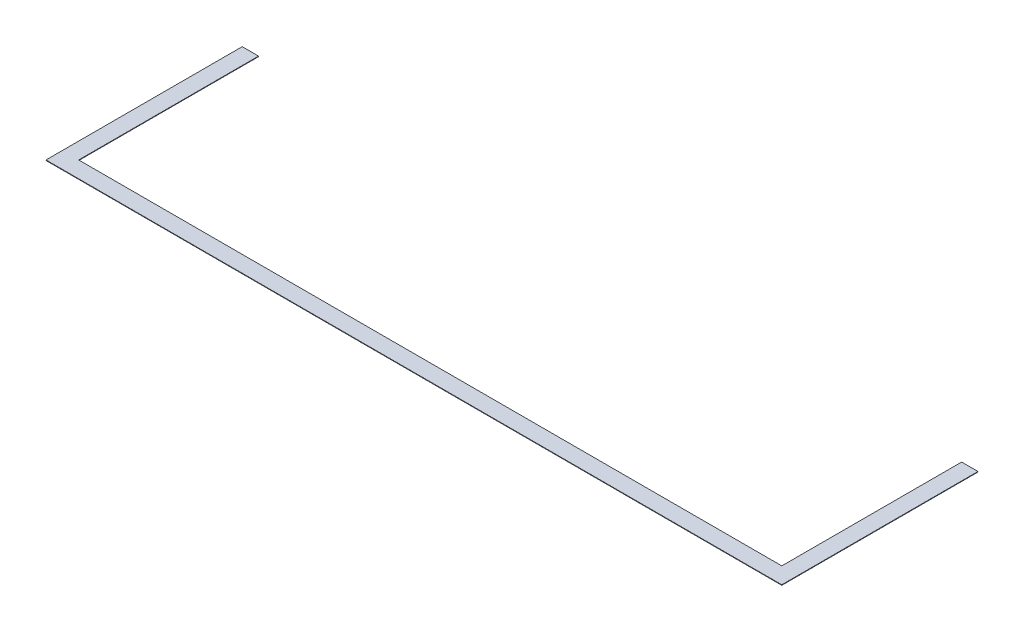
ISO-10303-21;
HEADER;
FILE_DESCRIPTION(('STEP AP214'),'2;1');
FILE_NAME('part.step','',(''),(''),'','','');
FILE_SCHEMA(('AUTOMOTIVE_DESIGN { 1 0 10303 214 1 1 1 1 }'));
ENDSEC;
DATA;
#1=APPLICATION_CONTEXT('core data for automotive mechanical design processes');
#2=APPLICATION_PROTOCOL_DEFINITION('international standard','automotive_design',2000,#1);
#3=PRODUCT_CONTEXT('',#1,'mechanical');
#4=PRODUCT('Part','Part','',(#3));
#5=PRODUCT_RELATED_PRODUCT_CATEGORY('part','',(#4));
#6=PRODUCT_DEFINITION_FORMATION('','',#4);
#7=PRODUCT_DEFINITION_CONTEXT('part definition',#1,'design');
#8=PRODUCT_DEFINITION('design','',#6,#7);
#9=PRODUCT_DEFINITION_SHAPE('','',#8);
#10=(LENGTH_UNIT() NAMED_UNIT(*) SI_UNIT(.MILLI.,.METRE.));
#11=(NAMED_UNIT(*) PLANE_ANGLE_UNIT() SI_UNIT($,.RADIAN.));
#12=(NAMED_UNIT(*) SI_UNIT($,.STERADIAN.) SOLID_ANGLE_UNIT());
#13=UNCERTAINTY_MEASURE_WITH_UNIT(LENGTH_MEASURE(1.E-05),#10,'distance_accuracy_value','');
#14=(GEOMETRIC_REPRESENTATION_CONTEXT(3) GLOBAL_UNCERTAINTY_ASSIGNED_CONTEXT((#13)) GLOBAL_UNIT_ASSIGNED_CONTEXT((#10,
#11,#12)) REPRESENTATION_CONTEXT('',''));
#15=CARTESIAN_POINT('',(0.,0.,0.));
#16=DIRECTION('',(0.,0.,1.));
#17=DIRECTION('',(1.,0.,0.));
#18=AXIS2_PLACEMENT_3D('',#15,#16,#17);
#19=CARTESIAN_POINT('',(0.,0.,0.));
#20=DIRECTION('',(0.,1.,0.));
#21=DIRECTION('',(0.,0.,1.));
#22=AXIS2_PLACEMENT_3D('',#19,#20,#21);
#23=PLANE('',#22);
#24=DIRECTION('',(0.,0.,1.));
#25=VECTOR('',#24,1.);
#26=CARTESIAN_POINT('',(50.8000000000002,0.,0.));
#27=LINE('',#26,#25);
#28=CARTESIAN_POINT('',(50.8,0.,0.));
#29=VERTEX_POINT('',#28);
#30=CARTESIAN_POINT('',(50.8000000000002,0.,558.8));
#31=VERTEX_POINT('',#30);
#32=EDGE_CURVE('E185',#29,#31,#27,.T.);
#33=ORIENTED_EDGE('',*,*,#32,.T.);
#34=DIRECTION('',(-1.,0.,0.));
#35=VECTOR('',#34,1.);
#36=CARTESIAN_POINT('',(0.,0.,558.8));
#37=LINE('',#36,#35);
#38=CARTESIAN_POINT('',(2235.2,0.,558.799999999999));
#39=VERTEX_POINT('',#38);
#40=EDGE_CURVE('E198',#39,#31,#37,.T.);
#41=ORIENTED_EDGE('',*,*,#40,.F.);
#42=DIRECTION('',(0.,0.,1.));
#43=VECTOR('',#42,1.);
#44=CARTESIAN_POINT('',(2235.2,0.,0.));
#45=LINE('',#44,#43);
#46=CARTESIAN_POINT('',(2235.2,0.,-1.84651795170424E-13));
#47=VERTEX_POINT('',#46);
#48=EDGE_CURVE('E136',#47,#39,#45,.T.);
#49=ORIENTED_EDGE('',*,*,#48,.F.);
#50=DIRECTION('',(-1.,0.,0.));
#51=VECTOR('',#50,1.);
#52=CARTESIAN_POINT('',(0.,0.,0.));
#53=LINE('',#52,#51);
#54=CARTESIAN_POINT('',(2286.,0.,-1.94289029309402E-13));
#55=VERTEX_POINT('',#54);
#56=EDGE_CURVE('E176',#55,#47,#53,.T.);
#57=ORIENTED_EDGE('',*,*,#56,.F.);
#58=DIRECTION('',(0.,0.,-1.));
#59=VECTOR('',#58,1.);
#60=CARTESIAN_POINT('',(2286.,0.,0.));
#61=LINE('',#60,#59);
#62=CARTESIAN_POINT('',(2286.,0.,609.6));
#63=VERTEX_POINT('',#62);
#64=EDGE_CURVE('E194',#63,#55,#61,.T.);
#65=ORIENTED_EDGE('',*,*,#64,.F.);
#66=DIRECTION('',(1.,0.,0.));
#67=VECTOR('',#66,1.);
#68=CARTESIAN_POINT('',(0.,0.,609.6));
#69=LINE('',#68,#67);
#70=CARTESIAN_POINT('',(0.,0.,609.6));
#71=VERTEX_POINT('',#70);
#72=EDGE_CURVE('E192',#71,#63,#69,.T.);
#73=ORIENTED_EDGE('',*,*,#72,.F.);
#74=DIRECTION('',(0.,0.,1.));
#75=VECTOR('',#74,1.);
#76=CARTESIAN_POINT('',(0.,0.,0.));
#77=LINE('',#76,#75);
#78=CARTESIAN_POINT('',(0.,0.,0.));
#79=VERTEX_POINT('',#78);
#80=EDGE_CURVE('E190',#79,#71,#77,.T.);
#81=ORIENTED_EDGE('',*,*,#80,.F.);
#82=DIRECTION('',(-1.,0.,0.));
#83=VECTOR('',#82,1.);
#84=CARTESIAN_POINT('',(0.,0.,0.));
#85=LINE('',#84,#83);
#86=EDGE_CURVE('E188',#29,#79,#85,.T.);
#87=ORIENTED_EDGE('',*,*,#86,.F.);
#88=EDGE_LOOP('',(#33,#41,#49,#57,#65,#73,#81,#87));
#89=FACE_BOUND('',#88,.T.);
#90=ADVANCED_FACE('F91',(#89),#23,.F.);
#91=CARTESIAN_POINT('',(0.,1.5875,558.8));
#92=DIRECTION('',(0.,0.,1.));
#93=DIRECTION('',(1.,0.,0.));
#94=AXIS2_PLACEMENT_3D('',#91,#92,#93);
#95=PLANE('',#94);
#96=ORIENTED_EDGE('',*,*,#40,.T.);
#97=DIRECTION('',(0.,-1.,0.));
#98=VECTOR('',#97,1.);
#99=CARTESIAN_POINT('',(50.8000000000002,1.5875,558.8));
#100=LINE('',#99,#98);
#101=CARTESIAN_POINT('',(50.8000000000002,1.5875,558.8));
#102=VERTEX_POINT('',#101);
#103=EDGE_CURVE('E143',#102,#31,#100,.T.);
#104=ORIENTED_EDGE('',*,*,#103,.F.);
#105=DIRECTION('',(-1.,0.,0.));
#106=VECTOR('',#105,1.);
#107=CARTESIAN_POINT('',(0.,1.5875,558.8));
#108=LINE('',#107,#106);
#109=CARTESIAN_POINT('',(2235.2,1.5875,558.799999999999));
#110=VERTEX_POINT('',#109);
#111=EDGE_CURVE('E108',#110,#102,#108,.T.);
#112=ORIENTED_EDGE('',*,*,#111,.F.);
#113=DIRECTION('',(0.,-1.,0.));
#114=VECTOR('',#113,1.);
#115=CARTESIAN_POINT('',(2235.2,1.5875,558.799999999999));
#116=LINE('',#115,#114);
#117=EDGE_CURVE('E178',#110,#39,#116,.T.);
#118=ORIENTED_EDGE('',*,*,#117,.T.);
#119=EDGE_LOOP('',(#96,#104,#112,#118));
#120=FACE_BOUND('',#119,.T.);
#121=ADVANCED_FACE('F241',(#120),#95,.F.);
#122=CARTESIAN_POINT('',(2235.2,1.5875,0.));
#123=DIRECTION('',(1.,0.,0.));
#124=DIRECTION('',(0.,0.,-1.));
#125=AXIS2_PLACEMENT_3D('',#122,#123,#124);
#126=PLANE('',#125);
#127=ORIENTED_EDGE('',*,*,#48,.T.);
#128=ORIENTED_EDGE('',*,*,#117,.F.);
#129=DIRECTION('',(0.,0.,1.));
#130=VECTOR('',#129,1.);
#131=CARTESIAN_POINT('',(2235.2,1.5875,0.));
#132=LINE('',#131,#130);
#133=CARTESIAN_POINT('',(2235.2,1.5875,-1.84651795170424E-13));
#134=VERTEX_POINT('',#133);
#135=EDGE_CURVE('E166',#134,#110,#132,.T.);
#136=ORIENTED_EDGE('',*,*,#135,.F.);
#137=DIRECTION('',(0.,-1.,0.));
#138=VECTOR('',#137,1.);
#139=CARTESIAN_POINT('',(2235.2,1.5875,-1.84651795170424E-13));
#140=LINE('',#139,#138);
#141=EDGE_CURVE('E173',#134,#47,#140,.T.);
#142=ORIENTED_EDGE('',*,*,#141,.T.);
#143=EDGE_LOOP('',(#127,#128,#136,#142));
#144=FACE_BOUND('',#143,.T.);
#145=ADVANCED_FACE('F180',(#144),#126,.F.);
#146=CARTESIAN_POINT('',(0.,1.5875,0.));
#147=DIRECTION('',(0.,0.,1.));
#148=DIRECTION('',(1.,0.,0.));
#149=AXIS2_PLACEMENT_3D('',#146,#147,#148);
#150=PLANE('',#149);
#151=ORIENTED_EDGE('',*,*,#56,.T.);
#152=ORIENTED_EDGE('',*,*,#141,.F.);
#153=DIRECTION('',(-1.,0.,0.));
#154=VECTOR('',#153,1.);
#155=CARTESIAN_POINT('',(0.,1.5875,0.));
#156=LINE('',#155,#154);
#157=CARTESIAN_POINT('',(2286.,1.5875,-1.94289029309402E-13));
#158=VERTEX_POINT('',#157);
#159=EDGE_CURVE('E162',#158,#134,#156,.T.);
#160=ORIENTED_EDGE('',*,*,#159,.F.);
#161=DIRECTION('',(0.,-1.,0.));
#162=VECTOR('',#161,1.);
#163=CARTESIAN_POINT('',(2286.,1.5875,-1.94289029309402E-13));
#164=LINE('',#163,#162);
#165=EDGE_CURVE('E177',#158,#55,#164,.T.);
#166=ORIENTED_EDGE('',*,*,#165,.T.);
#167=EDGE_LOOP('',(#151,#152,#160,#166));
#168=FACE_BOUND('',#167,.T.);
#169=ADVANCED_FACE('F174',(#168),#150,.F.);
#170=CARTESIAN_POINT('',(2286.,1.5875,0.));
#171=DIRECTION('',(-1.,0.,0.));
#172=DIRECTION('',(0.,0.,1.));
#173=AXIS2_PLACEMENT_3D('',#170,#171,#172);
#174=PLANE('',#173);
#175=ORIENTED_EDGE('',*,*,#64,.T.);
#176=ORIENTED_EDGE('',*,*,#165,.F.);
#177=DIRECTION('',(0.,0.,-1.));
#178=VECTOR('',#177,1.);
#179=CARTESIAN_POINT('',(2286.,1.5875,0.));
#180=LINE('',#179,#178);
#181=CARTESIAN_POINT('',(2286.,1.5875,609.6));
#182=VERTEX_POINT('',#181);
#183=EDGE_CURVE('E168',#182,#158,#180,.T.);
#184=ORIENTED_EDGE('',*,*,#183,.F.);
#185=DIRECTION('',(0.,-1.,0.));
#186=VECTOR('',#185,1.);
#187=CARTESIAN_POINT('',(2286.,1.5875,609.6));
#188=LINE('',#187,#186);
#189=EDGE_CURVE('E204',#182,#63,#188,.T.);
#190=ORIENTED_EDGE('',*,*,#189,.T.);
#191=EDGE_LOOP('',(#175,#176,#184,#190));
#192=FACE_BOUND('',#191,.T.);
#193=ADVANCED_FACE('F227',(#192),#174,.F.);
#194=CARTESIAN_POINT('',(0.,1.5875,609.6));
#195=DIRECTION('',(0.,0.,-1.));
#196=DIRECTION('',(-1.,0.,0.));
#197=AXIS2_PLACEMENT_3D('',#194,#195,#196);
#198=PLANE('',#197);
#199=ORIENTED_EDGE('',*,*,#72,.T.);
#200=ORIENTED_EDGE('',*,*,#189,.F.);
#201=DIRECTION('',(1.,0.,0.));
#202=VECTOR('',#201,1.);
#203=CARTESIAN_POINT('',(0.,1.5875,609.6));
#204=LINE('',#203,#202);
#205=CARTESIAN_POINT('',(0.,1.5875,609.6));
#206=VERTEX_POINT('',#205);
#207=EDGE_CURVE('E228',#206,#182,#204,.T.);
#208=ORIENTED_EDGE('',*,*,#207,.F.);
#209=DIRECTION('',(0.,-1.,0.));
#210=VECTOR('',#209,1.);
#211=CARTESIAN_POINT('',(0.,1.5875,609.6));
#212=LINE('',#211,#210);
#213=EDGE_CURVE('E207',#206,#71,#212,.T.);
#214=ORIENTED_EDGE('',*,*,#213,.T.);
#215=EDGE_LOOP('',(#199,#200,#208,#214));
#216=FACE_BOUND('',#215,.T.);
#217=ADVANCED_FACE('F224',(#216),#198,.F.);
#218=CARTESIAN_POINT('',(0.,1.5875,0.));
#219=DIRECTION('',(1.,0.,0.));
#220=DIRECTION('',(0.,0.,-1.));
#221=AXIS2_PLACEMENT_3D('',#218,#219,#220);
#222=PLANE('',#221);
#223=ORIENTED_EDGE('',*,*,#80,.T.);
#224=ORIENTED_EDGE('',*,*,#213,.F.);
#225=DIRECTION('',(0.,0.,1.));
#226=VECTOR('',#225,1.);
#227=CARTESIAN_POINT('',(0.,1.5875,0.));
#228=LINE('',#227,#226);
#229=CARTESIAN_POINT('',(0.,1.5875,0.));
#230=VERTEX_POINT('',#229);
#231=EDGE_CURVE('E216',#230,#206,#228,.T.);
#232=ORIENTED_EDGE('',*,*,#231,.F.);
#233=DIRECTION('',(0.,-1.,0.));
#234=VECTOR('',#233,1.);
#235=CARTESIAN_POINT('',(0.,1.5875,0.));
#236=LINE('',#235,#234);
#237=EDGE_CURVE('E100',#230,#79,#236,.T.);
#238=ORIENTED_EDGE('',*,*,#237,.T.);
#239=EDGE_LOOP('',(#223,#224,#232,#238));
#240=FACE_BOUND('',#239,.T.);
#241=ADVANCED_FACE('F214',(#240),#222,.F.);
#242=CARTESIAN_POINT('',(0.,1.5875,0.));
#243=DIRECTION('',(0.,0.,1.));
#244=DIRECTION('',(1.,0.,0.));
#245=AXIS2_PLACEMENT_3D('',#242,#243,#244);
#246=PLANE('',#245);
#247=ORIENTED_EDGE('',*,*,#86,.T.);
#248=ORIENTED_EDGE('',*,*,#237,.F.);
#249=DIRECTION('',(-1.,0.,0.));
#250=VECTOR('',#249,1.);
#251=CARTESIAN_POINT('',(0.,1.5875,0.));
#252=LINE('',#251,#250);
#253=CARTESIAN_POINT('',(50.8,1.5875,0.));
#254=VERTEX_POINT('',#253);
#255=EDGE_CURVE('E232',#254,#230,#252,.T.);
#256=ORIENTED_EDGE('',*,*,#255,.F.);
#257=DIRECTION('',(0.,-1.,0.));
#258=VECTOR('',#257,1.);
#259=CARTESIAN_POINT('',(50.8,1.5875,0.));
#260=LINE('',#259,#258);
#261=EDGE_CURVE('E12',#254,#29,#260,.T.);
#262=ORIENTED_EDGE('',*,*,#261,.T.);
#263=EDGE_LOOP('',(#247,#248,#256,#262));
#264=FACE_BOUND('',#263,.T.);
#265=ADVANCED_FACE('F234',(#264),#246,.F.);
#266=CARTESIAN_POINT('',(50.8000000000002,1.5875,0.));
#267=DIRECTION('',(1.,0.,0.));
#268=DIRECTION('',(0.,0.,-1.));
#269=AXIS2_PLACEMENT_3D('',#266,#267,#268);
#270=PLANE('',#269);
#271=ORIENTED_EDGE('',*,*,#32,.F.);
#272=ORIENTED_EDGE('',*,*,#261,.F.);
#273=DIRECTION('',(0.,0.,1.));
#274=VECTOR('',#273,1.);
#275=CARTESIAN_POINT('',(50.8000000000002,1.5875,0.));
#276=LINE('',#275,#274);
#277=EDGE_CURVE('E200',#254,#102,#276,.T.);
#278=ORIENTED_EDGE('',*,*,#277,.T.);
#279=ORIENTED_EDGE('',*,*,#103,.T.);
#280=EDGE_LOOP('',(#271,#272,#278,#279));
#281=FACE_BOUND('',#280,.T.);
#282=ADVANCED_FACE('F93',(#281),#270,.T.);
#283=CARTESIAN_POINT('',(0.,1.5875,0.));
#284=DIRECTION('',(0.,1.,0.));
#285=DIRECTION('',(0.,0.,1.));
#286=AXIS2_PLACEMENT_3D('',#283,#284,#285);
#287=PLANE('',#286);
#288=ORIENTED_EDGE('',*,*,#277,.F.);
#289=ORIENTED_EDGE('',*,*,#255,.T.);
#290=ORIENTED_EDGE('',*,*,#231,.T.);
#291=ORIENTED_EDGE('',*,*,#207,.T.);
#292=ORIENTED_EDGE('',*,*,#183,.T.);
#293=ORIENTED_EDGE('',*,*,#159,.T.);
#294=ORIENTED_EDGE('',*,*,#135,.T.);
#295=ORIENTED_EDGE('',*,*,#111,.T.);
#296=EDGE_LOOP('',(#288,#289,#290,#291,#292,#293,#294,#295));
#297=FACE_BOUND('',#296,.T.);
#298=ADVANCED_FACE('F164',(#297),#287,.T.);
#299=CLOSED_SHELL('',(#90,#121,#145,#169,#193,#217,#241,#265,#282,#298));
#300=MANIFOLD_SOLID_BREP('B2',#299);
#301=ADVANCED_BREP_SHAPE_REPRESENTATION('',(#18,#300),#14);
#302=SHAPE_DEFINITION_REPRESENTATION(#9,#301);
ENDSEC;
END-ISO-10303-21;
